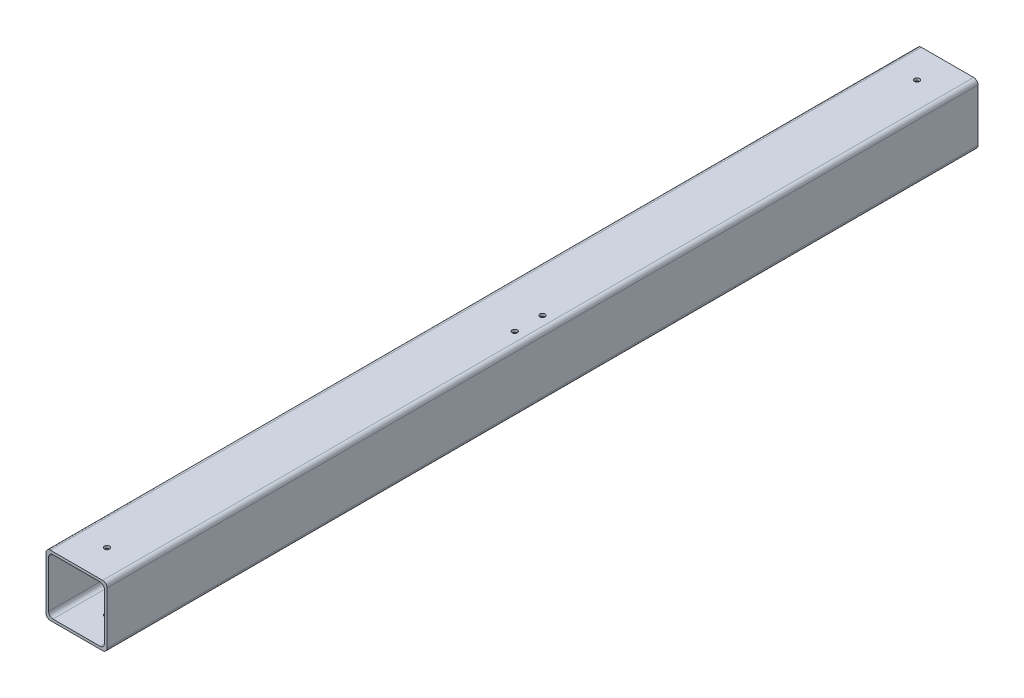
ISO-10303-21;
HEADER;
FILE_DESCRIPTION(('STEP AP214'),'2;1');
FILE_NAME('part.step','',(''),(''),'','','');
FILE_SCHEMA(('AUTOMOTIVE_DESIGN { 1 0 10303 214 1 1 1 1 }'));
ENDSEC;
DATA;
#1=APPLICATION_CONTEXT('core data for automotive mechanical design processes');
#2=APPLICATION_PROTOCOL_DEFINITION('international standard','automotive_design',2000,#1);
#3=PRODUCT_CONTEXT('',#1,'mechanical');
#4=PRODUCT('Part','Part','',(#3));
#5=PRODUCT_RELATED_PRODUCT_CATEGORY('part','',(#4));
#6=PRODUCT_DEFINITION_FORMATION('','',#4);
#7=PRODUCT_DEFINITION_CONTEXT('part definition',#1,'design');
#8=PRODUCT_DEFINITION('design','',#6,#7);
#9=PRODUCT_DEFINITION_SHAPE('','',#8);
#10=(LENGTH_UNIT() NAMED_UNIT(*) SI_UNIT(.MILLI.,.METRE.));
#11=(NAMED_UNIT(*) PLANE_ANGLE_UNIT() SI_UNIT($,.RADIAN.));
#12=(NAMED_UNIT(*) SI_UNIT($,.STERADIAN.) SOLID_ANGLE_UNIT());
#13=UNCERTAINTY_MEASURE_WITH_UNIT(LENGTH_MEASURE(1.E-05),#10,'distance_accuracy_value','');
#14=(GEOMETRIC_REPRESENTATION_CONTEXT(3) GLOBAL_UNCERTAINTY_ASSIGNED_CONTEXT((#13)) GLOBAL_UNIT_ASSIGNED_CONTEXT((#10,
#11,#12)) REPRESENTATION_CONTEXT('',''));
#15=CARTESIAN_POINT('',(0.,0.,0.));
#16=DIRECTION('',(0.,0.,1.));
#17=DIRECTION('',(1.,0.,0.));
#18=AXIS2_PLACEMENT_3D('',#15,#16,#17);
#19=CARTESIAN_POINT('',(0.,0.,1000.));
#20=DIRECTION('',(0.,1.,0.));
#21=DIRECTION('',(0.,0.,1.));
#22=AXIS2_PLACEMENT_3D('',#19,#20,#21);
#23=PLANE('',#22);
#24=DIRECTION('',(1.,0.,0.));
#25=VECTOR('',#24,1.);
#26=CARTESIAN_POINT('',(0.,0.,1000.));
#27=LINE('',#26,#25);
#28=CARTESIAN_POINT('',(5.,0.,1000.));
#29=VERTEX_POINT('',#28);
#30=CARTESIAN_POINT('',(65.,0.,1000.));
#31=VERTEX_POINT('',#30);
#32=EDGE_CURVE('E310',#29,#31,#27,.T.);
#33=ORIENTED_EDGE('',*,*,#32,.F.);
#34=DIRECTION('',(0.,0.,-1.));
#35=VECTOR('',#34,1.);
#36=CARTESIAN_POINT('',(5.,0.,1000.));
#37=LINE('',#36,#35);
#38=CARTESIAN_POINT('',(5.,0.,0.));
#39=VERTEX_POINT('',#38);
#40=EDGE_CURVE('E217',#29,#39,#37,.T.);
#41=ORIENTED_EDGE('',*,*,#40,.T.);
#42=DIRECTION('',(1.,0.,0.));
#43=VECTOR('',#42,1.);
#44=CARTESIAN_POINT('',(0.,0.,0.));
#45=LINE('',#44,#43);
#46=CARTESIAN_POINT('',(65.,0.,0.));
#47=VERTEX_POINT('',#46);
#48=EDGE_CURVE('E317',#39,#47,#45,.T.);
#49=ORIENTED_EDGE('',*,*,#48,.T.);
#50=DIRECTION('',(0.,0.,-1.));
#51=VECTOR('',#50,1.);
#52=CARTESIAN_POINT('',(65.,0.,1000.));
#53=LINE('',#52,#51);
#54=EDGE_CURVE('E215',#47,#31,#53,.F.);
#55=ORIENTED_EDGE('',*,*,#54,.T.);
#56=EDGE_LOOP('',(#33,#41,#49,#55));
#57=FACE_BOUND('',#56,.T.);
#58=CARTESIAN_POINT('',(35.,0.,35.));
#59=DIRECTION('',(0.,1.,0.));
#60=DIRECTION('',(0.,0.,1.));
#61=AXIS2_PLACEMENT_3D('',#58,#59,#60);
#62=CIRCLE('',#61,3.);
#63=CARTESIAN_POINT('',(35.,0.,38.));
#64=VERTEX_POINT('',#63);
#65=EDGE_CURVE('E275',#64,#64,#62,.T.);
#66=ORIENTED_EDGE('',*,*,#65,.T.);
#67=EDGE_LOOP('',(#66));
#68=FACE_BOUND('',#67,.T.);
#69=CARTESIAN_POINT('',(35.0000000000001,0.,965.));
#70=DIRECTION('',(0.,1.,0.));
#71=DIRECTION('',(0.,0.,1.));
#72=AXIS2_PLACEMENT_3D('',#69,#70,#71);
#73=CIRCLE('',#72,3.);
#74=CARTESIAN_POINT('',(35.0000000000001,0.,968.));
#75=VERTEX_POINT('',#74);
#76=EDGE_CURVE('E246',#75,#75,#73,.T.);
#77=ORIENTED_EDGE('',*,*,#76,.T.);
#78=EDGE_LOOP('',(#77));
#79=FACE_BOUND('',#78,.T.);
#80=CARTESIAN_POINT('',(54.09,0.,484.09));
#81=DIRECTION('',(0.,1.,0.));
#82=DIRECTION('',(0.,0.,1.));
#83=AXIS2_PLACEMENT_3D('',#80,#81,#82);
#84=CIRCLE('',#83,3.);
#85=CARTESIAN_POINT('',(54.09,0.,487.09));
#86=VERTEX_POINT('',#85);
#87=EDGE_CURVE('E264',#86,#86,#84,.T.);
#88=ORIENTED_EDGE('',*,*,#87,.T.);
#89=EDGE_LOOP('',(#88));
#90=FACE_BOUND('',#89,.T.);
#91=CARTESIAN_POINT('',(54.09,0.,515.91));
#92=DIRECTION('',(0.,-1.,0.));
#93=DIRECTION('',(0.,0.,-1.));
#94=AXIS2_PLACEMENT_3D('',#91,#92,#93);
#95=CIRCLE('',#94,3.);
#96=CARTESIAN_POINT('',(54.09,0.,512.91));
#97=VERTEX_POINT('',#96);
#98=EDGE_CURVE('E259',#97,#97,#95,.T.);
#99=ORIENTED_EDGE('',*,*,#98,.F.);
#100=EDGE_LOOP('',(#99));
#101=FACE_BOUND('',#100,.T.);
#102=ADVANCED_FACE('F37',(#57,#68,#79,#90,#101),#23,.F.);
#103=CARTESIAN_POINT('',(0.,70.,1000.));
#104=DIRECTION('',(0.,-1.,0.));
#105=DIRECTION('',(0.,0.,-1.));
#106=AXIS2_PLACEMENT_3D('',#103,#104,#105);
#107=PLANE('',#106);
#108=DIRECTION('',(-1.,0.,0.));
#109=VECTOR('',#108,1.);
#110=CARTESIAN_POINT('',(0.,70.,0.));
#111=LINE('',#110,#109);
#112=CARTESIAN_POINT('',(65.,70.,0.));
#113=VERTEX_POINT('',#112);
#114=CARTESIAN_POINT('',(5.00000000000002,70.,0.));
#115=VERTEX_POINT('',#114);
#116=EDGE_CURVE('E182',#113,#115,#111,.T.);
#117=ORIENTED_EDGE('',*,*,#116,.T.);
#118=DIRECTION('',(0.,0.,-1.));
#119=VECTOR('',#118,1.);
#120=CARTESIAN_POINT('',(5.00000000000002,70.,1000.));
#121=LINE('',#120,#119);
#122=CARTESIAN_POINT('',(5.00000000000002,70.,1000.));
#123=VERTEX_POINT('',#122);
#124=EDGE_CURVE('E205',#115,#123,#121,.F.);
#125=ORIENTED_EDGE('',*,*,#124,.T.);
#126=DIRECTION('',(-1.,0.,0.));
#127=VECTOR('',#126,1.);
#128=CARTESIAN_POINT('',(0.,70.,1000.));
#129=LINE('',#128,#127);
#130=CARTESIAN_POINT('',(65.,70.,1000.));
#131=VERTEX_POINT('',#130);
#132=EDGE_CURVE('E174',#131,#123,#129,.T.);
#133=ORIENTED_EDGE('',*,*,#132,.F.);
#134=DIRECTION('',(0.,0.,-1.));
#135=VECTOR('',#134,1.);
#136=CARTESIAN_POINT('',(65.,70.,1000.));
#137=LINE('',#136,#135);
#138=EDGE_CURVE('E202',#131,#113,#137,.T.);
#139=ORIENTED_EDGE('',*,*,#138,.T.);
#140=EDGE_LOOP('',(#117,#125,#133,#139));
#141=FACE_BOUND('',#140,.T.);
#142=CARTESIAN_POINT('',(35.,70.,35.));
#143=DIRECTION('',(0.,1.,0.));
#144=DIRECTION('',(0.,0.,1.));
#145=AXIS2_PLACEMENT_3D('',#142,#143,#144);
#146=CIRCLE('',#145,3.);
#147=CARTESIAN_POINT('',(35.,70.,38.));
#148=VERTEX_POINT('',#147);
#149=EDGE_CURVE('E281',#148,#148,#146,.T.);
#150=ORIENTED_EDGE('',*,*,#149,.F.);
#151=EDGE_LOOP('',(#150));
#152=FACE_BOUND('',#151,.T.);
#153=CARTESIAN_POINT('',(35.0000000000001,70.,965.));
#154=DIRECTION('',(0.,1.,0.));
#155=DIRECTION('',(0.,0.,1.));
#156=AXIS2_PLACEMENT_3D('',#153,#154,#155);
#157=CIRCLE('',#156,3.);
#158=CARTESIAN_POINT('',(35.0000000000001,70.,968.));
#159=VERTEX_POINT('',#158);
#160=EDGE_CURVE('E278',#159,#159,#157,.T.);
#161=ORIENTED_EDGE('',*,*,#160,.F.);
#162=EDGE_LOOP('',(#161));
#163=FACE_BOUND('',#162,.T.);
#164=CARTESIAN_POINT('',(54.09,70.,484.09));
#165=DIRECTION('',(0.,1.,0.));
#166=DIRECTION('',(0.,0.,1.));
#167=AXIS2_PLACEMENT_3D('',#164,#165,#166);
#168=CIRCLE('',#167,3.);
#169=CARTESIAN_POINT('',(54.09,70.,487.09));
#170=VERTEX_POINT('',#169);
#171=EDGE_CURVE('E269',#170,#170,#168,.T.);
#172=ORIENTED_EDGE('',*,*,#171,.F.);
#173=EDGE_LOOP('',(#172));
#174=FACE_BOUND('',#173,.T.);
#175=CARTESIAN_POINT('',(54.09,70.,515.91));
#176=DIRECTION('',(0.,-1.,0.));
#177=DIRECTION('',(0.,0.,-1.));
#178=AXIS2_PLACEMENT_3D('',#175,#176,#177);
#179=CIRCLE('',#178,3.);
#180=CARTESIAN_POINT('',(54.09,70.,512.91));
#181=VERTEX_POINT('',#180);
#182=EDGE_CURVE('E253',#181,#181,#179,.T.);
#183=ORIENTED_EDGE('',*,*,#182,.T.);
#184=EDGE_LOOP('',(#183));
#185=FACE_BOUND('',#184,.T.);
#186=ADVANCED_FACE('F328',(#141,#152,#163,#174,#185),#107,.F.);
#187=CARTESIAN_POINT('',(3.,3.,1000.));
#188=DIRECTION('',(0.,1.,0.));
#189=DIRECTION('',(0.,0.,1.));
#190=AXIS2_PLACEMENT_3D('',#187,#188,#189);
#191=PLANE('',#190);
#192=CARTESIAN_POINT('',(54.09,3.,484.09));
#193=DIRECTION('',(0.,1.,0.));
#194=DIRECTION('',(0.,0.,1.));
#195=AXIS2_PLACEMENT_3D('',#192,#193,#194);
#196=CIRCLE('',#195,3.);
#197=CARTESIAN_POINT('',(54.09,3.,487.09));
#198=VERTEX_POINT('',#197);
#199=EDGE_CURVE('E252',#198,#198,#196,.F.);
#200=ORIENTED_EDGE('',*,*,#199,.T.);
#201=EDGE_LOOP('',(#200));
#202=FACE_BOUND('',#201,.T.);
#203=CARTESIAN_POINT('',(35.0000000000001,3.,965.));
#204=DIRECTION('',(0.,1.,0.));
#205=DIRECTION('',(0.,0.,1.));
#206=AXIS2_PLACEMENT_3D('',#203,#204,#205);
#207=CIRCLE('',#206,3.);
#208=CARTESIAN_POINT('',(35.0000000000001,3.,968.));
#209=VERTEX_POINT('',#208);
#210=EDGE_CURVE('E249',#209,#209,#207,.T.);
#211=ORIENTED_EDGE('',*,*,#210,.F.);
#212=EDGE_LOOP('',(#211));
#213=FACE_BOUND('',#212,.T.);
#214=CARTESIAN_POINT('',(35.,3.,35.));
#215=DIRECTION('',(0.,1.,0.));
#216=DIRECTION('',(0.,0.,1.));
#217=AXIS2_PLACEMENT_3D('',#214,#215,#216);
#218=CIRCLE('',#217,3.);
#219=CARTESIAN_POINT('',(35.,3.,38.));
#220=VERTEX_POINT('',#219);
#221=EDGE_CURVE('E245',#220,#220,#218,.T.);
#222=ORIENTED_EDGE('',*,*,#221,.F.);
#223=EDGE_LOOP('',(#222));
#224=FACE_BOUND('',#223,.T.);
#225=DIRECTION('',(1.,0.,0.));
#226=VECTOR('',#225,1.);
#227=CARTESIAN_POINT('',(3.,3.,1000.));
#228=LINE('',#227,#226);
#229=CARTESIAN_POINT('',(8.,3.,1000.));
#230=VERTEX_POINT('',#229);
#231=CARTESIAN_POINT('',(62.,3.,1000.));
#232=VERTEX_POINT('',#231);
#233=EDGE_CURVE('E294',#230,#232,#228,.T.);
#234=ORIENTED_EDGE('',*,*,#233,.T.);
#235=DIRECTION('',(0.,0.,-1.));
#236=VECTOR('',#235,1.);
#237=CARTESIAN_POINT('',(62.,3.,0.));
#238=LINE('',#237,#236);
#239=CARTESIAN_POINT('',(62.,3.,0.));
#240=VERTEX_POINT('',#239);
#241=EDGE_CURVE('E221',#232,#240,#238,.T.);
#242=ORIENTED_EDGE('',*,*,#241,.T.);
#243=DIRECTION('',(1.,0.,0.));
#244=VECTOR('',#243,1.);
#245=CARTESIAN_POINT('',(3.,3.,0.));
#246=LINE('',#245,#244);
#247=CARTESIAN_POINT('',(8.,3.,0.));
#248=VERTEX_POINT('',#247);
#249=EDGE_CURVE('E157',#248,#240,#246,.T.);
#250=ORIENTED_EDGE('',*,*,#249,.F.);
#251=DIRECTION('',(0.,0.,-1.));
#252=VECTOR('',#251,1.);
#253=CARTESIAN_POINT('',(8.,3.,1000.));
#254=LINE('',#253,#252);
#255=EDGE_CURVE('E61',#248,#230,#254,.F.);
#256=ORIENTED_EDGE('',*,*,#255,.T.);
#257=EDGE_LOOP('',(#234,#242,#250,#256));
#258=FACE_BOUND('',#257,.T.);
#259=CARTESIAN_POINT('',(54.09,3.,515.91));
#260=DIRECTION('',(0.,1.,0.));
#261=DIRECTION('',(0.,0.,1.));
#262=AXIS2_PLACEMENT_3D('',#259,#260,#261);
#263=CIRCLE('',#262,3.);
#264=CARTESIAN_POINT('',(54.09,3.,518.91));
#265=VERTEX_POINT('',#264);
#266=EDGE_CURVE('E272',#265,#265,#263,.T.);
#267=ORIENTED_EDGE('',*,*,#266,.F.);
#268=EDGE_LOOP('',(#267));
#269=FACE_BOUND('',#268,.T.);
#270=ADVANCED_FACE('F376',(#202,#213,#224,#258,#269),#191,.T.);
#271=CARTESIAN_POINT('',(3.,67.,1000.));
#272=DIRECTION('',(0.,-1.,0.));
#273=DIRECTION('',(0.,0.,-1.));
#274=AXIS2_PLACEMENT_3D('',#271,#272,#273);
#275=PLANE('',#274);
#276=CARTESIAN_POINT('',(54.09,67.,484.09));
#277=DIRECTION('',(0.,-1.,0.));
#278=DIRECTION('',(0.,0.,-1.));
#279=AXIS2_PLACEMENT_3D('',#276,#277,#278);
#280=CIRCLE('',#279,3.);
#281=CARTESIAN_POINT('',(54.09,67.,481.09));
#282=VERTEX_POINT('',#281);
#283=EDGE_CURVE('E250',#282,#282,#280,.F.);
#284=ORIENTED_EDGE('',*,*,#283,.T.);
#285=EDGE_LOOP('',(#284));
#286=FACE_BOUND('',#285,.T.);
#287=CARTESIAN_POINT('',(35.0000000000001,67.,965.));
#288=DIRECTION('',(0.,-1.,0.));
#289=DIRECTION('',(0.,0.,-1.));
#290=AXIS2_PLACEMENT_3D('',#287,#288,#289);
#291=CIRCLE('',#290,3.);
#292=CARTESIAN_POINT('',(35.0000000000001,67.,962.));
#293=VERTEX_POINT('',#292);
#294=EDGE_CURVE('E247',#293,#293,#291,.T.);
#295=ORIENTED_EDGE('',*,*,#294,.F.);
#296=EDGE_LOOP('',(#295));
#297=FACE_BOUND('',#296,.T.);
#298=CARTESIAN_POINT('',(35.,67.,35.));
#299=DIRECTION('',(0.,-1.,0.));
#300=DIRECTION('',(0.,0.,-1.));
#301=AXIS2_PLACEMENT_3D('',#298,#299,#300);
#302=CIRCLE('',#301,3.);
#303=CARTESIAN_POINT('',(35.,67.,32.));
#304=VERTEX_POINT('',#303);
#305=EDGE_CURVE('E242',#304,#304,#302,.T.);
#306=ORIENTED_EDGE('',*,*,#305,.F.);
#307=EDGE_LOOP('',(#306));
#308=FACE_BOUND('',#307,.T.);
#309=DIRECTION('',(-1.,0.,0.));
#310=VECTOR('',#309,1.);
#311=CARTESIAN_POINT('',(3.,67.,0.));
#312=LINE('',#311,#310);
#313=CARTESIAN_POINT('',(62.,67.,0.));
#314=VERTEX_POINT('',#313);
#315=CARTESIAN_POINT('',(8.,67.,0.));
#316=VERTEX_POINT('',#315);
#317=EDGE_CURVE('E171',#314,#316,#312,.T.);
#318=ORIENTED_EDGE('',*,*,#317,.F.);
#319=DIRECTION('',(0.,0.,-1.));
#320=VECTOR('',#319,1.);
#321=CARTESIAN_POINT('',(62.,67.,1000.));
#322=LINE('',#321,#320);
#323=CARTESIAN_POINT('',(62.,67.,1000.));
#324=VERTEX_POINT('',#323);
#325=EDGE_CURVE('E187',#314,#324,#322,.F.);
#326=ORIENTED_EDGE('',*,*,#325,.T.);
#327=DIRECTION('',(-1.,0.,0.));
#328=VECTOR('',#327,1.);
#329=CARTESIAN_POINT('',(3.,67.,1000.));
#330=LINE('',#329,#328);
#331=CARTESIAN_POINT('',(8.,67.,1000.));
#332=VERTEX_POINT('',#331);
#333=EDGE_CURVE('E298',#324,#332,#330,.T.);
#334=ORIENTED_EDGE('',*,*,#333,.T.);
#335=DIRECTION('',(0.,0.,-1.));
#336=VECTOR('',#335,1.);
#337=CARTESIAN_POINT('',(8.,67.,0.));
#338=LINE('',#337,#336);
#339=EDGE_CURVE('E176',#332,#316,#338,.T.);
#340=ORIENTED_EDGE('',*,*,#339,.T.);
#341=EDGE_LOOP('',(#318,#326,#334,#340));
#342=FACE_BOUND('',#341,.T.);
#343=CARTESIAN_POINT('',(54.09,67.,515.91));
#344=DIRECTION('',(0.,-1.,0.));
#345=DIRECTION('',(0.,0.,-1.));
#346=AXIS2_PLACEMENT_3D('',#343,#344,#345);
#347=CIRCLE('',#346,3.);
#348=CARTESIAN_POINT('',(54.09,67.,512.91));
#349=VERTEX_POINT('',#348);
#350=EDGE_CURVE('E41',#349,#349,#347,.T.);
#351=ORIENTED_EDGE('',*,*,#350,.F.);
#352=EDGE_LOOP('',(#351));
#353=FACE_BOUND('',#352,.T.);
#354=ADVANCED_FACE('F368',(#286,#297,#308,#342,#353),#275,.T.);
#355=CARTESIAN_POINT('',(0.,0.,1000.));
#356=DIRECTION('',(0.,0.,-1.));
#357=DIRECTION('',(-1.,0.,0.));
#358=AXIS2_PLACEMENT_3D('',#355,#356,#357);
#359=PLANE('',#358);
#360=ORIENTED_EDGE('',*,*,#132,.T.);
#361=CARTESIAN_POINT('',(5.00000000000002,65.,1000.));
#362=DIRECTION('',(0.,0.,-1.));
#363=DIRECTION('',(-1.,0.,0.));
#364=AXIS2_PLACEMENT_3D('',#361,#362,#363);
#365=CIRCLE('',#364,5.);
#366=CARTESIAN_POINT('',(0.,65.,1000.));
#367=VERTEX_POINT('',#366);
#368=EDGE_CURVE('E213',#123,#367,#365,.F.);
#369=ORIENTED_EDGE('',*,*,#368,.T.);
#370=DIRECTION('',(0.,-1.,0.));
#371=VECTOR('',#370,1.);
#372=CARTESIAN_POINT('',(0.,0.,1000.));
#373=LINE('',#372,#371);
#374=CARTESIAN_POINT('',(0.,5.,1000.));
#375=VERTEX_POINT('',#374);
#376=EDGE_CURVE('E307',#367,#375,#373,.T.);
#377=ORIENTED_EDGE('',*,*,#376,.T.);
#378=CARTESIAN_POINT('',(5.,5.,1000.));
#379=DIRECTION('',(0.,0.,-1.));
#380=DIRECTION('',(-1.,0.,0.));
#381=AXIS2_PLACEMENT_3D('',#378,#379,#380);
#382=CIRCLE('',#381,5.);
#383=EDGE_CURVE('E211',#375,#29,#382,.F.);
#384=ORIENTED_EDGE('',*,*,#383,.T.);
#385=ORIENTED_EDGE('',*,*,#32,.T.);
#386=CARTESIAN_POINT('',(65.,5.,1000.));
#387=DIRECTION('',(0.,0.,-1.));
#388=DIRECTION('',(-1.,0.,0.));
#389=AXIS2_PLACEMENT_3D('',#386,#387,#388);
#390=CIRCLE('',#389,5.);
#391=CARTESIAN_POINT('',(70.,5.,1000.));
#392=VERTEX_POINT('',#391);
#393=EDGE_CURVE('E209',#31,#392,#390,.F.);
#394=ORIENTED_EDGE('',*,*,#393,.T.);
#395=DIRECTION('',(0.,1.,0.));
#396=VECTOR('',#395,1.);
#397=CARTESIAN_POINT('',(70.,0.,1000.));
#398=LINE('',#397,#396);
#399=CARTESIAN_POINT('',(70.,65.,1000.));
#400=VERTEX_POINT('',#399);
#401=EDGE_CURVE('E179',#392,#400,#398,.T.);
#402=ORIENTED_EDGE('',*,*,#401,.T.);
#403=CARTESIAN_POINT('',(65.,65.,1000.));
#404=DIRECTION('',(0.,0.,-1.));
#405=DIRECTION('',(-1.,0.,0.));
#406=AXIS2_PLACEMENT_3D('',#403,#404,#405);
#407=CIRCLE('',#406,5.);
#408=EDGE_CURVE('E207',#400,#131,#407,.F.);
#409=ORIENTED_EDGE('',*,*,#408,.T.);
#410=EDGE_LOOP('',(#360,#369,#377,#384,#385,#394,#402,#409));
#411=FACE_BOUND('',#410,.T.);
#412=DIRECTION('',(0.,-1.,0.));
#413=VECTOR('',#412,1.);
#414=CARTESIAN_POINT('',(3.,3.,1000.));
#415=LINE('',#414,#413);
#416=CARTESIAN_POINT('',(3.,62.,1000.));
#417=VERTEX_POINT('',#416);
#418=CARTESIAN_POINT('',(3.,8.,1000.));
#419=VERTEX_POINT('',#418);
#420=EDGE_CURVE('E291',#417,#419,#415,.T.);
#421=ORIENTED_EDGE('',*,*,#420,.F.);
#422=CARTESIAN_POINT('',(8.,62.,1000.));
#423=DIRECTION('',(0.,0.,-1.));
#424=DIRECTION('',(-1.,0.,0.));
#425=AXIS2_PLACEMENT_3D('',#422,#423,#424);
#426=CIRCLE('',#425,5.);
#427=EDGE_CURVE('E11',#417,#332,#426,.T.);
#428=ORIENTED_EDGE('',*,*,#427,.T.);
#429=ORIENTED_EDGE('',*,*,#333,.F.);
#430=CARTESIAN_POINT('',(62.,62.,1000.));
#431=DIRECTION('',(0.,0.,-1.));
#432=DIRECTION('',(-1.,0.,0.));
#433=AXIS2_PLACEMENT_3D('',#430,#431,#432);
#434=CIRCLE('',#433,5.);
#435=CARTESIAN_POINT('',(67.,62.,1000.));
#436=VERTEX_POINT('',#435);
#437=EDGE_CURVE('E162',#324,#436,#434,.T.);
#438=ORIENTED_EDGE('',*,*,#437,.T.);
#439=DIRECTION('',(0.,1.,0.));
#440=VECTOR('',#439,1.);
#441=CARTESIAN_POINT('',(67.,3.,1000.));
#442=LINE('',#441,#440);
#443=CARTESIAN_POINT('',(67.,8.,1000.));
#444=VERTEX_POINT('',#443);
#445=EDGE_CURVE('E296',#444,#436,#442,.T.);
#446=ORIENTED_EDGE('',*,*,#445,.F.);
#447=CARTESIAN_POINT('',(62.,8.,1000.));
#448=DIRECTION('',(0.,0.,-1.));
#449=DIRECTION('',(-1.,0.,0.));
#450=AXIS2_PLACEMENT_3D('',#447,#448,#449);
#451=CIRCLE('',#450,5.);
#452=EDGE_CURVE('E54',#444,#232,#451,.T.);
#453=ORIENTED_EDGE('',*,*,#452,.T.);
#454=ORIENTED_EDGE('',*,*,#233,.F.);
#455=CARTESIAN_POINT('',(8.,8.,1000.));
#456=DIRECTION('',(0.,0.,-1.));
#457=DIRECTION('',(-1.,0.,0.));
#458=AXIS2_PLACEMENT_3D('',#455,#456,#457);
#459=CIRCLE('',#458,5.);
#460=EDGE_CURVE('E239',#230,#419,#459,.T.);
#461=ORIENTED_EDGE('',*,*,#460,.T.);
#462=EDGE_LOOP('',(#421,#428,#429,#438,#446,#453,#454,#461));
#463=FACE_BOUND('',#462,.T.);
#464=ADVANCED_FACE('F339',(#411,#463),#359,.F.);
#465=CARTESIAN_POINT('',(0.,0.,0.));
#466=DIRECTION('',(0.,0.,-1.));
#467=DIRECTION('',(-1.,0.,0.));
#468=AXIS2_PLACEMENT_3D('',#465,#466,#467);
#469=PLANE('',#468);
#470=DIRECTION('',(0.,-1.,0.));
#471=VECTOR('',#470,1.);
#472=CARTESIAN_POINT('',(0.,0.,0.));
#473=LINE('',#472,#471);
#474=CARTESIAN_POINT('',(0.,65.,0.));
#475=VERTEX_POINT('',#474);
#476=CARTESIAN_POINT('',(0.,5.,0.));
#477=VERTEX_POINT('',#476);
#478=EDGE_CURVE('E301',#475,#477,#473,.T.);
#479=ORIENTED_EDGE('',*,*,#478,.F.);
#480=CARTESIAN_POINT('',(5.00000000000002,65.,0.));
#481=DIRECTION('',(0.,0.,-1.));
#482=DIRECTION('',(-1.,0.,0.));
#483=AXIS2_PLACEMENT_3D('',#480,#481,#482);
#484=CIRCLE('',#483,5.);
#485=EDGE_CURVE('E200',#475,#115,#484,.T.);
#486=ORIENTED_EDGE('',*,*,#485,.T.);
#487=ORIENTED_EDGE('',*,*,#116,.F.);
#488=CARTESIAN_POINT('',(65.,65.,0.));
#489=DIRECTION('',(0.,0.,-1.));
#490=DIRECTION('',(-1.,0.,0.));
#491=AXIS2_PLACEMENT_3D('',#488,#489,#490);
#492=CIRCLE('',#491,5.);
#493=CARTESIAN_POINT('',(70.,65.,0.));
#494=VERTEX_POINT('',#493);
#495=EDGE_CURVE('E194',#113,#494,#492,.T.);
#496=ORIENTED_EDGE('',*,*,#495,.T.);
#497=DIRECTION('',(0.,1.,0.));
#498=VECTOR('',#497,1.);
#499=CARTESIAN_POINT('',(70.,0.,0.));
#500=LINE('',#499,#498);
#501=CARTESIAN_POINT('',(70.,5.,0.));
#502=VERTEX_POINT('',#501);
#503=EDGE_CURVE('E319',#502,#494,#500,.T.);
#504=ORIENTED_EDGE('',*,*,#503,.F.);
#505=CARTESIAN_POINT('',(65.,5.,0.));
#506=DIRECTION('',(0.,0.,-1.));
#507=DIRECTION('',(-1.,0.,0.));
#508=AXIS2_PLACEMENT_3D('',#505,#506,#507);
#509=CIRCLE('',#508,5.);
#510=EDGE_CURVE('E196',#502,#47,#509,.T.);
#511=ORIENTED_EDGE('',*,*,#510,.T.);
#512=ORIENTED_EDGE('',*,*,#48,.F.);
#513=CARTESIAN_POINT('',(5.,5.,0.));
#514=DIRECTION('',(0.,0.,-1.));
#515=DIRECTION('',(-1.,0.,0.));
#516=AXIS2_PLACEMENT_3D('',#513,#514,#515);
#517=CIRCLE('',#516,5.);
#518=EDGE_CURVE('E198',#39,#477,#517,.T.);
#519=ORIENTED_EDGE('',*,*,#518,.T.);
#520=EDGE_LOOP('',(#479,#486,#487,#496,#504,#511,#512,#519));
#521=FACE_BOUND('',#520,.T.);
#522=DIRECTION('',(0.,1.,0.));
#523=VECTOR('',#522,1.);
#524=CARTESIAN_POINT('',(67.,3.,0.));
#525=LINE('',#524,#523);
#526=CARTESIAN_POINT('',(67.,8.,0.));
#527=VERTEX_POINT('',#526);
#528=CARTESIAN_POINT('',(67.,62.,0.));
#529=VERTEX_POINT('',#528);
#530=EDGE_CURVE('E156',#527,#529,#525,.T.);
#531=ORIENTED_EDGE('',*,*,#530,.T.);
#532=CARTESIAN_POINT('',(62.,62.,0.));
#533=DIRECTION('',(0.,0.,-1.));
#534=DIRECTION('',(-1.,0.,0.));
#535=AXIS2_PLACEMENT_3D('',#532,#533,#534);
#536=CIRCLE('',#535,5.);
#537=EDGE_CURVE('E233',#529,#314,#536,.F.);
#538=ORIENTED_EDGE('',*,*,#537,.T.);
#539=ORIENTED_EDGE('',*,*,#317,.T.);
#540=CARTESIAN_POINT('',(8.,62.,0.));
#541=DIRECTION('',(0.,0.,-1.));
#542=DIRECTION('',(-1.,0.,0.));
#543=AXIS2_PLACEMENT_3D('',#540,#541,#542);
#544=CIRCLE('',#543,5.);
#545=CARTESIAN_POINT('',(3.,62.,0.));
#546=VERTEX_POINT('',#545);
#547=EDGE_CURVE('E46',#316,#546,#544,.F.);
#548=ORIENTED_EDGE('',*,*,#547,.T.);
#549=DIRECTION('',(0.,-1.,0.));
#550=VECTOR('',#549,1.);
#551=CARTESIAN_POINT('',(3.,3.,0.));
#552=LINE('',#551,#550);
#553=CARTESIAN_POINT('',(3.,8.,0.));
#554=VERTEX_POINT('',#553);
#555=EDGE_CURVE('E290',#546,#554,#552,.T.);
#556=ORIENTED_EDGE('',*,*,#555,.T.);
#557=CARTESIAN_POINT('',(8.,8.,0.));
#558=DIRECTION('',(0.,0.,-1.));
#559=DIRECTION('',(-1.,0.,0.));
#560=AXIS2_PLACEMENT_3D('',#557,#558,#559);
#561=CIRCLE('',#560,5.);
#562=EDGE_CURVE('E237',#554,#248,#561,.F.);
#563=ORIENTED_EDGE('',*,*,#562,.T.);
#564=ORIENTED_EDGE('',*,*,#249,.T.);
#565=CARTESIAN_POINT('',(62.,8.,0.));
#566=DIRECTION('',(0.,0.,-1.));
#567=DIRECTION('',(-1.,0.,0.));
#568=AXIS2_PLACEMENT_3D('',#565,#566,#567);
#569=CIRCLE('',#568,5.);
#570=EDGE_CURVE('E153',#240,#527,#569,.F.);
#571=ORIENTED_EDGE('',*,*,#570,.T.);
#572=EDGE_LOOP('',(#531,#538,#539,#548,#556,#563,#564,#571));
#573=FACE_BOUND('',#572,.T.);
#574=ADVANCED_FACE('F155',(#521,#573),#469,.T.);
#575=CARTESIAN_POINT('',(0.,0.,1000.));
#576=DIRECTION('',(1.,0.,0.));
#577=DIRECTION('',(0.,1.,0.));
#578=AXIS2_PLACEMENT_3D('',#575,#576,#577);
#579=PLANE('',#578);
#580=ORIENTED_EDGE('',*,*,#376,.F.);
#581=DIRECTION('',(0.,0.,-1.));
#582=VECTOR('',#581,1.);
#583=CARTESIAN_POINT('',(0.,65.,1000.));
#584=LINE('',#583,#582);
#585=EDGE_CURVE('E191',#367,#475,#584,.T.);
#586=ORIENTED_EDGE('',*,*,#585,.T.);
#587=ORIENTED_EDGE('',*,*,#478,.T.);
#588=DIRECTION('',(0.,0.,-1.));
#589=VECTOR('',#588,1.);
#590=CARTESIAN_POINT('',(0.,5.,1000.));
#591=LINE('',#590,#589);
#592=EDGE_CURVE('E189',#477,#375,#591,.F.);
#593=ORIENTED_EDGE('',*,*,#592,.T.);
#594=EDGE_LOOP('',(#580,#586,#587,#593));
#595=FACE_BOUND('',#594,.T.);
#596=ADVANCED_FACE('F342',(#595),#579,.F.);
#597=CARTESIAN_POINT('',(70.,0.,1000.));
#598=DIRECTION('',(-1.,0.,0.));
#599=DIRECTION('',(0.,0.,1.));
#600=AXIS2_PLACEMENT_3D('',#597,#598,#599);
#601=PLANE('',#600);
#602=ORIENTED_EDGE('',*,*,#401,.F.);
#603=DIRECTION('',(0.,0.,-1.));
#604=VECTOR('',#603,1.);
#605=CARTESIAN_POINT('',(70.,5.,1000.));
#606=LINE('',#605,#604);
#607=EDGE_CURVE('E225',#392,#502,#606,.T.);
#608=ORIENTED_EDGE('',*,*,#607,.T.);
#609=ORIENTED_EDGE('',*,*,#503,.T.);
#610=DIRECTION('',(0.,0.,-1.));
#611=VECTOR('',#610,1.);
#612=CARTESIAN_POINT('',(70.,65.,1000.));
#613=LINE('',#612,#611);
#614=EDGE_CURVE('E223',#494,#400,#613,.F.);
#615=ORIENTED_EDGE('',*,*,#614,.T.);
#616=EDGE_LOOP('',(#602,#608,#609,#615));
#617=FACE_BOUND('',#616,.T.);
#618=ADVANCED_FACE('F359',(#617),#601,.F.);
#619=CARTESIAN_POINT('',(3.,3.,1000.));
#620=DIRECTION('',(1.,0.,0.));
#621=DIRECTION('',(0.,0.,-1.));
#622=AXIS2_PLACEMENT_3D('',#619,#620,#621);
#623=PLANE('',#622);
#624=ORIENTED_EDGE('',*,*,#420,.T.);
#625=DIRECTION('',(0.,0.,-1.));
#626=VECTOR('',#625,1.);
#627=CARTESIAN_POINT('',(3.,8.,0.));
#628=LINE('',#627,#626);
#629=EDGE_CURVE('E230',#419,#554,#628,.T.);
#630=ORIENTED_EDGE('',*,*,#629,.T.);
#631=ORIENTED_EDGE('',*,*,#555,.F.);
#632=DIRECTION('',(0.,0.,-1.));
#633=VECTOR('',#632,1.);
#634=CARTESIAN_POINT('',(3.,62.,1000.));
#635=LINE('',#634,#633);
#636=EDGE_CURVE('E228',#546,#417,#635,.F.);
#637=ORIENTED_EDGE('',*,*,#636,.T.);
#638=EDGE_LOOP('',(#624,#630,#631,#637));
#639=FACE_BOUND('',#638,.T.);
#640=ADVANCED_FACE('F413',(#639),#623,.T.);
#641=CARTESIAN_POINT('',(67.,3.,1000.));
#642=DIRECTION('',(-1.,0.,0.));
#643=DIRECTION('',(0.,-1.,0.));
#644=AXIS2_PLACEMENT_3D('',#641,#642,#643);
#645=PLANE('',#644);
#646=ORIENTED_EDGE('',*,*,#445,.T.);
#647=DIRECTION('',(0.,0.,-1.));
#648=VECTOR('',#647,1.);
#649=CARTESIAN_POINT('',(67.,62.,0.));
#650=LINE('',#649,#648);
#651=EDGE_CURVE('E170',#436,#529,#650,.T.);
#652=ORIENTED_EDGE('',*,*,#651,.T.);
#653=ORIENTED_EDGE('',*,*,#530,.F.);
#654=DIRECTION('',(0.,0.,-1.));
#655=VECTOR('',#654,1.);
#656=CARTESIAN_POINT('',(67.,8.,1000.));
#657=LINE('',#656,#655);
#658=EDGE_CURVE('E168',#527,#444,#657,.F.);
#659=ORIENTED_EDGE('',*,*,#658,.T.);
#660=EDGE_LOOP('',(#646,#652,#653,#659));
#661=FACE_BOUND('',#660,.T.);
#662=ADVANCED_FACE('F167',(#661),#645,.T.);
#663=CARTESIAN_POINT('',(62.,62.,1000.));
#664=DIRECTION('',(0.,0.,1.));
#665=DIRECTION('',(1.,0.,0.));
#666=AXIS2_PLACEMENT_3D('',#663,#664,#665);
#667=CYLINDRICAL_SURFACE('',#666,5.);
#668=ORIENTED_EDGE('',*,*,#437,.F.);
#669=ORIENTED_EDGE('',*,*,#325,.F.);
#670=ORIENTED_EDGE('',*,*,#537,.F.);
#671=ORIENTED_EDGE('',*,*,#651,.F.);
#672=EDGE_LOOP('',(#668,#669,#670,#671));
#673=FACE_BOUND('',#672,.T.);
#674=ADVANCED_FACE('F379',(#673),#667,.F.);
#675=CARTESIAN_POINT('',(5.00000000000002,65.,1000.));
#676=DIRECTION('',(0.,0.,-1.));
#677=DIRECTION('',(-1.,0.,0.));
#678=AXIS2_PLACEMENT_3D('',#675,#676,#677);
#679=CYLINDRICAL_SURFACE('',#678,5.);
#680=ORIENTED_EDGE('',*,*,#368,.F.);
#681=ORIENTED_EDGE('',*,*,#124,.F.);
#682=ORIENTED_EDGE('',*,*,#485,.F.);
#683=ORIENTED_EDGE('',*,*,#585,.F.);
#684=EDGE_LOOP('',(#680,#681,#682,#683));
#685=FACE_BOUND('',#684,.T.);
#686=ADVANCED_FACE('F335',(#685),#679,.T.);
#687=CARTESIAN_POINT('',(5.,5.,1000.));
#688=DIRECTION('',(0.,0.,-1.));
#689=DIRECTION('',(-1.,0.,0.));
#690=AXIS2_PLACEMENT_3D('',#687,#688,#689);
#691=CYLINDRICAL_SURFACE('',#690,5.);
#692=ORIENTED_EDGE('',*,*,#383,.F.);
#693=ORIENTED_EDGE('',*,*,#592,.F.);
#694=ORIENTED_EDGE('',*,*,#518,.F.);
#695=ORIENTED_EDGE('',*,*,#40,.F.);
#696=EDGE_LOOP('',(#692,#693,#694,#695));
#697=FACE_BOUND('',#696,.T.);
#698=ADVANCED_FACE('F346',(#697),#691,.T.);
#699=CARTESIAN_POINT('',(62.,8.,1000.));
#700=DIRECTION('',(0.,0.,1.));
#701=DIRECTION('',(1.,0.,0.));
#702=AXIS2_PLACEMENT_3D('',#699,#700,#701);
#703=CYLINDRICAL_SURFACE('',#702,5.);
#704=ORIENTED_EDGE('',*,*,#452,.F.);
#705=ORIENTED_EDGE('',*,*,#658,.F.);
#706=ORIENTED_EDGE('',*,*,#570,.F.);
#707=ORIENTED_EDGE('',*,*,#241,.F.);
#708=EDGE_LOOP('',(#704,#705,#706,#707));
#709=FACE_BOUND('',#708,.T.);
#710=ADVANCED_FACE('F173',(#709),#703,.F.);
#711=CARTESIAN_POINT('',(65.,5.,1000.));
#712=DIRECTION('',(0.,0.,-1.));
#713=DIRECTION('',(-1.,0.,0.));
#714=AXIS2_PLACEMENT_3D('',#711,#712,#713);
#715=CYLINDRICAL_SURFACE('',#714,5.);
#716=ORIENTED_EDGE('',*,*,#393,.F.);
#717=ORIENTED_EDGE('',*,*,#54,.F.);
#718=ORIENTED_EDGE('',*,*,#510,.F.);
#719=ORIENTED_EDGE('',*,*,#607,.F.);
#720=EDGE_LOOP('',(#716,#717,#718,#719));
#721=FACE_BOUND('',#720,.T.);
#722=ADVANCED_FACE('F355',(#721),#715,.T.);
#723=CARTESIAN_POINT('',(8.,8.,1000.));
#724=DIRECTION('',(0.,0.,1.));
#725=DIRECTION('',(1.,0.,0.));
#726=AXIS2_PLACEMENT_3D('',#723,#724,#725);
#727=CYLINDRICAL_SURFACE('',#726,5.);
#728=ORIENTED_EDGE('',*,*,#460,.F.);
#729=ORIENTED_EDGE('',*,*,#255,.F.);
#730=ORIENTED_EDGE('',*,*,#562,.F.);
#731=ORIENTED_EDGE('',*,*,#629,.F.);
#732=EDGE_LOOP('',(#728,#729,#730,#731));
#733=FACE_BOUND('',#732,.T.);
#734=ADVANCED_FACE('F391',(#733),#727,.F.);
#735=CARTESIAN_POINT('',(8.,62.,1000.));
#736=DIRECTION('',(0.,0.,1.));
#737=DIRECTION('',(1.,0.,0.));
#738=AXIS2_PLACEMENT_3D('',#735,#736,#737);
#739=CYLINDRICAL_SURFACE('',#738,5.);
#740=ORIENTED_EDGE('',*,*,#427,.F.);
#741=ORIENTED_EDGE('',*,*,#636,.F.);
#742=ORIENTED_EDGE('',*,*,#547,.F.);
#743=ORIENTED_EDGE('',*,*,#339,.F.);
#744=EDGE_LOOP('',(#740,#741,#742,#743));
#745=FACE_BOUND('',#744,.T.);
#746=ADVANCED_FACE('F393',(#745),#739,.F.);
#747=CARTESIAN_POINT('',(65.,65.,1000.));
#748=DIRECTION('',(0.,0.,-1.));
#749=DIRECTION('',(-1.,0.,0.));
#750=AXIS2_PLACEMENT_3D('',#747,#748,#749);
#751=CYLINDRICAL_SURFACE('',#750,5.);
#752=ORIENTED_EDGE('',*,*,#408,.F.);
#753=ORIENTED_EDGE('',*,*,#614,.F.);
#754=ORIENTED_EDGE('',*,*,#495,.F.);
#755=ORIENTED_EDGE('',*,*,#138,.F.);
#756=EDGE_LOOP('',(#752,#753,#754,#755));
#757=FACE_BOUND('',#756,.T.);
#758=ADVANCED_FACE('F39',(#757),#751,.T.);
#759=CARTESIAN_POINT('',(35.,0.,35.));
#760=DIRECTION('',(0.,1.,0.));
#761=DIRECTION('',(0.,0.,1.));
#762=AXIS2_PLACEMENT_3D('',#759,#760,#761);
#763=CYLINDRICAL_SURFACE('',#762,3.);
#764=ORIENTED_EDGE('',*,*,#305,.T.);
#765=EDGE_LOOP('',(#764));
#766=FACE_BOUND('',#765,.T.);
#767=ORIENTED_EDGE('',*,*,#149,.T.);
#768=EDGE_LOOP('',(#767));
#769=FACE_BOUND('',#768,.T.);
#770=ADVANCED_FACE('F400',(#766,#769),#763,.F.);
#771=CARTESIAN_POINT('',(35.0000000000001,0.,965.));
#772=DIRECTION('',(0.,1.,0.));
#773=DIRECTION('',(0.,0.,1.));
#774=AXIS2_PLACEMENT_3D('',#771,#772,#773);
#775=CYLINDRICAL_SURFACE('',#774,3.);
#776=ORIENTED_EDGE('',*,*,#294,.T.);
#777=EDGE_LOOP('',(#776));
#778=FACE_BOUND('',#777,.T.);
#779=ORIENTED_EDGE('',*,*,#160,.T.);
#780=EDGE_LOOP('',(#779));
#781=FACE_BOUND('',#780,.T.);
#782=ADVANCED_FACE('F553',(#778,#781),#775,.F.);
#783=ORIENTED_EDGE('',*,*,#221,.T.);
#784=EDGE_LOOP('',(#783));
#785=FACE_BOUND('',#784,.T.);
#786=ORIENTED_EDGE('',*,*,#65,.F.);
#787=EDGE_LOOP('',(#786));
#788=FACE_BOUND('',#787,.T.);
#789=ADVANCED_FACE('F555',(#785,#788),#763,.F.);
#790=ORIENTED_EDGE('',*,*,#210,.T.);
#791=EDGE_LOOP('',(#790));
#792=FACE_BOUND('',#791,.T.);
#793=ORIENTED_EDGE('',*,*,#76,.F.);
#794=EDGE_LOOP('',(#793));
#795=FACE_BOUND('',#794,.T.);
#796=ADVANCED_FACE('F441',(#792,#795),#775,.F.);
#797=CARTESIAN_POINT('',(54.09,70.,484.09));
#798=DIRECTION('',(0.,-1.,0.));
#799=DIRECTION('',(0.,0.,-1.));
#800=AXIS2_PLACEMENT_3D('',#797,#798,#799);
#801=CYLINDRICAL_SURFACE('',#800,3.);
#802=ORIENTED_EDGE('',*,*,#283,.F.);
#803=EDGE_LOOP('',(#802));
#804=FACE_BOUND('',#803,.T.);
#805=ORIENTED_EDGE('',*,*,#171,.T.);
#806=EDGE_LOOP('',(#805));
#807=FACE_BOUND('',#806,.T.);
#808=ADVANCED_FACE('F435',(#804,#807),#801,.F.);
#809=CARTESIAN_POINT('',(54.09,70.,515.91));
#810=DIRECTION('',(0.,-1.,0.));
#811=DIRECTION('',(0.,0.,-1.));
#812=AXIS2_PLACEMENT_3D('',#809,#810,#811);
#813=CYLINDRICAL_SURFACE('',#812,3.);
#814=ORIENTED_EDGE('',*,*,#350,.T.);
#815=EDGE_LOOP('',(#814));
#816=FACE_BOUND('',#815,.T.);
#817=ORIENTED_EDGE('',*,*,#182,.F.);
#818=EDGE_LOOP('',(#817));
#819=FACE_BOUND('',#818,.T.);
#820=ADVANCED_FACE('F427',(#816,#819),#813,.F.);
#821=ORIENTED_EDGE('',*,*,#199,.F.);
#822=EDGE_LOOP('',(#821));
#823=FACE_BOUND('',#822,.T.);
#824=ORIENTED_EDGE('',*,*,#87,.F.);
#825=EDGE_LOOP('',(#824));
#826=FACE_BOUND('',#825,.T.);
#827=ADVANCED_FACE('F425',(#823,#826),#801,.F.);
#828=ORIENTED_EDGE('',*,*,#266,.T.);
#829=EDGE_LOOP('',(#828));
#830=FACE_BOUND('',#829,.T.);
#831=ORIENTED_EDGE('',*,*,#98,.T.);
#832=EDGE_LOOP('',(#831));
#833=FACE_BOUND('',#832,.T.);
#834=ADVANCED_FACE('F422',(#830,#833),#813,.F.);
#835=CLOSED_SHELL('',(#102,#186,#270,#354,#464,#574,#596,#618,#640,#662,#674,#686,#698,#710,
#722,#734,#746,#758,#770,#782,#789,#796,#808,#820,#827,#834));
#836=MANIFOLD_SOLID_BREP('B2',#835);
#837=ADVANCED_BREP_SHAPE_REPRESENTATION('',(#18,#836),#14);
#838=SHAPE_DEFINITION_REPRESENTATION(#9,#837);
ENDSEC;
END-ISO-10303-21;
